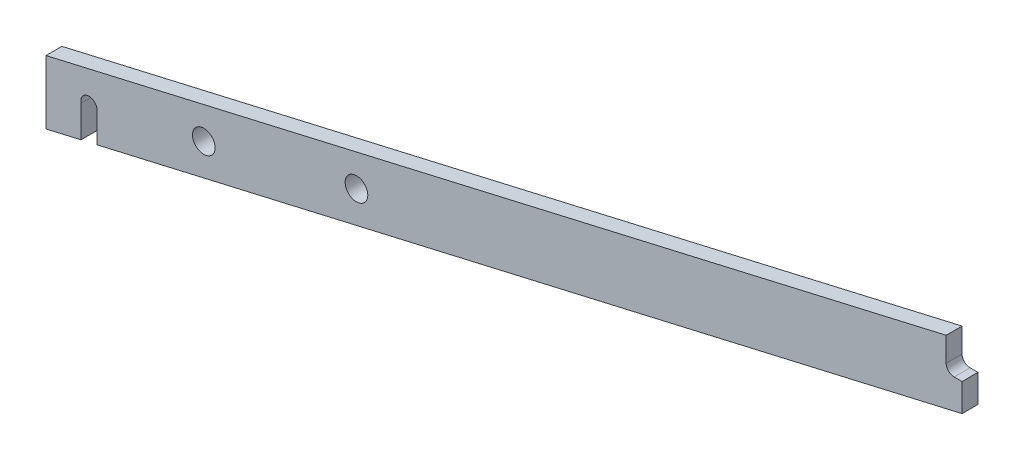
ISO-10303-21;
HEADER;
FILE_DESCRIPTION(('STEP AP214'),'2;1');
FILE_NAME('part.step','',(''),(''),'','','');
FILE_SCHEMA(('AUTOMOTIVE_DESIGN { 1 0 10303 214 1 1 1 1 }'));
ENDSEC;
DATA;
#1=APPLICATION_CONTEXT('core data for automotive mechanical design processes');
#2=APPLICATION_PROTOCOL_DEFINITION('international standard','automotive_design',2000,#1);
#3=PRODUCT_CONTEXT('',#1,'mechanical');
#4=PRODUCT('Part','Part','',(#3));
#5=PRODUCT_RELATED_PRODUCT_CATEGORY('part','',(#4));
#6=PRODUCT_DEFINITION_FORMATION('','',#4);
#7=PRODUCT_DEFINITION_CONTEXT('part definition',#1,'design');
#8=PRODUCT_DEFINITION('design','',#6,#7);
#9=PRODUCT_DEFINITION_SHAPE('','',#8);
#10=(LENGTH_UNIT() NAMED_UNIT(*) SI_UNIT(.MILLI.,.METRE.));
#11=(NAMED_UNIT(*) PLANE_ANGLE_UNIT() SI_UNIT($,.RADIAN.));
#12=(NAMED_UNIT(*) SI_UNIT($,.STERADIAN.) SOLID_ANGLE_UNIT());
#13=UNCERTAINTY_MEASURE_WITH_UNIT(LENGTH_MEASURE(1.E-05),#10,'distance_accuracy_value','');
#14=(GEOMETRIC_REPRESENTATION_CONTEXT(3) GLOBAL_UNCERTAINTY_ASSIGNED_CONTEXT((#13)) GLOBAL_UNIT_ASSIGNED_CONTEXT((#10,
#11,#12)) REPRESENTATION_CONTEXT('',''));
#15=CARTESIAN_POINT('',(0.,0.,0.));
#16=DIRECTION('',(0.,0.,1.));
#17=DIRECTION('',(1.,0.,0.));
#18=AXIS2_PLACEMENT_3D('',#15,#16,#17);
#19=CARTESIAN_POINT('',(0.,0.,1.5875));
#20=DIRECTION('',(-0.224951054343859,0.974370064785237,0.));
#21=DIRECTION('',(-0.974370064785237,-0.224951054343859,0.));
#22=AXIS2_PLACEMENT_3D('',#19,#20,#21);
#23=PLANE('',#22);
#24=DIRECTION('',(0.974370064785237,0.224951054343859,0.));
#25=VECTOR('',#24,1.);
#26=CARTESIAN_POINT('',(0.,0.,1.5875));
#27=LINE('',#26,#25);
#28=CARTESIAN_POINT('',(5.08,1.17281041091784,1.5875));
#29=VERTEX_POINT('',#28);
#30=CARTESIAN_POINT('',(91.44,21.1105873965209,1.5875));
#31=VERTEX_POINT('',#30);
#32=EDGE_CURVE('E159',#29,#31,#27,.T.);
#33=ORIENTED_EDGE('',*,*,#32,.F.);
#34=DIRECTION('',(0.,0.,1.));
#35=VECTOR('',#34,1.);
#36=CARTESIAN_POINT('',(5.08,1.17281041091784,-0.000999999999999916));
#37=LINE('',#36,#35);
#38=CARTESIAN_POINT('',(5.08,1.17281041091784,0.));
#39=VERTEX_POINT('',#38);
#40=EDGE_CURVE('E198',#39,#29,#37,.T.);
#41=ORIENTED_EDGE('',*,*,#40,.F.);
#42=DIRECTION('',(0.974370064785237,0.224951054343859,0.));
#43=VECTOR('',#42,1.);
#44=CARTESIAN_POINT('',(0.,0.,0.));
#45=LINE('',#44,#43);
#46=CARTESIAN_POINT('',(91.44,21.1105873965209,0.));
#47=VERTEX_POINT('',#46);
#48=EDGE_CURVE('E186',#39,#47,#45,.T.);
#49=ORIENTED_EDGE('',*,*,#48,.T.);
#50=DIRECTION('',(0.,0.,-1.));
#51=VECTOR('',#50,1.);
#52=CARTESIAN_POINT('',(91.44,21.1105873965209,1.5875));
#53=LINE('',#52,#51);
#54=EDGE_CURVE('E11',#31,#47,#53,.T.);
#55=ORIENTED_EDGE('',*,*,#54,.F.);
#56=EDGE_LOOP('',(#33,#41,#49,#55));
#57=FACE_BOUND('',#56,.T.);
#58=ADVANCED_FACE('F42',(#57),#23,.F.);
#59=CARTESIAN_POINT('',(0.,0.,0.));
#60=VERTEX_POINT('',#59);
#61=CARTESIAN_POINT('',(3.4925,0.806307157506014,0.));
#62=VERTEX_POINT('',#61);
#63=EDGE_CURVE('E162',#60,#62,#45,.T.);
#64=ORIENTED_EDGE('',*,*,#63,.T.);
#65=DIRECTION('',(0.,0.,1.));
#66=VECTOR('',#65,1.);
#67=CARTESIAN_POINT('',(3.4925,0.806307157506014,-0.000999999999999916));
#68=LINE('',#67,#66);
#69=CARTESIAN_POINT('',(3.4925,0.806307157506014,1.5875));
#70=VERTEX_POINT('',#69);
#71=EDGE_CURVE('E204',#62,#70,#68,.T.);
#72=ORIENTED_EDGE('',*,*,#71,.T.);
#73=CARTESIAN_POINT('',(0.,0.,1.5875));
#74=VERTEX_POINT('',#73);
#75=EDGE_CURVE('E210',#74,#70,#27,.T.);
#76=ORIENTED_EDGE('',*,*,#75,.F.);
#77=DIRECTION('',(0.,0.,-1.));
#78=VECTOR('',#77,1.);
#79=CARTESIAN_POINT('',(0.,0.,1.5875));
#80=LINE('',#79,#78);
#81=EDGE_CURVE('E166',#74,#60,#80,.T.);
#82=ORIENTED_EDGE('',*,*,#81,.T.);
#83=EDGE_LOOP('',(#64,#72,#76,#82));
#84=FACE_BOUND('',#83,.T.);
#85=ADVANCED_FACE('F44',(#84),#23,.F.);
#86=CARTESIAN_POINT('',(91.44,21.1105873965209,1.5875));
#87=DIRECTION('',(-1.,0.,0.));
#88=DIRECTION('',(0.,0.,1.));
#89=AXIS2_PLACEMENT_3D('',#86,#87,#88);
#90=PLANE('',#89);
#91=DIRECTION('',(0.,1.,0.));
#92=VECTOR('',#91,1.);
#93=CARTESIAN_POINT('',(91.44,21.1105873965209,0.));
#94=LINE('',#93,#92);
#95=CARTESIAN_POINT('',(91.44,23.8887123965209,0.));
#96=VERTEX_POINT('',#95);
#97=EDGE_CURVE('E155',#47,#96,#94,.T.);
#98=ORIENTED_EDGE('',*,*,#97,.T.);
#99=DIRECTION('',(0.,0.,1.));
#100=VECTOR('',#99,1.);
#101=CARTESIAN_POINT('',(91.44,23.8887123965209,-0.000999999999999916));
#102=LINE('',#101,#100);
#103=CARTESIAN_POINT('',(91.44,23.8887123965209,1.5875));
#104=VERTEX_POINT('',#103);
#105=EDGE_CURVE('E147',#96,#104,#102,.T.);
#106=ORIENTED_EDGE('',*,*,#105,.T.);
#107=DIRECTION('',(0.,1.,0.));
#108=VECTOR('',#107,1.);
#109=CARTESIAN_POINT('',(91.44,21.1105873965209,1.5875));
#110=LINE('',#109,#108);
#111=EDGE_CURVE('E181',#31,#104,#110,.T.);
#112=ORIENTED_EDGE('',*,*,#111,.F.);
#113=ORIENTED_EDGE('',*,*,#54,.T.);
#114=EDGE_LOOP('',(#98,#106,#112,#113));
#115=FACE_BOUND('',#114,.T.);
#116=ADVANCED_FACE('F223',(#115),#90,.F.);
#117=CARTESIAN_POINT('',(91.44,27.4605873965209,1.5875));
#118=DIRECTION('',(0.224951054343859,-0.974370064785237,0.));
#119=DIRECTION('',(0.974370064785237,0.224951054343859,0.));
#120=AXIS2_PLACEMENT_3D('',#117,#118,#119);
#121=PLANE('',#120);
#122=DIRECTION('',(-0.974370064785237,-0.224951054343859,0.));
#123=VECTOR('',#122,1.);
#124=CARTESIAN_POINT('',(91.44,27.4605873965209,1.5875));
#125=LINE('',#124,#123);
#126=CARTESIAN_POINT('',(89.8525,27.0940841431091,1.5875));
#127=VERTEX_POINT('',#126);
#128=CARTESIAN_POINT('',(0.,6.35,1.5875));
#129=VERTEX_POINT('',#128);
#130=EDGE_CURVE('E145',#127,#129,#125,.T.);
#131=ORIENTED_EDGE('',*,*,#130,.F.);
#132=DIRECTION('',(0.,0.,1.));
#133=VECTOR('',#132,1.);
#134=CARTESIAN_POINT('',(89.8525,27.0940841431091,-0.000999999999999916));
#135=LINE('',#134,#133);
#136=CARTESIAN_POINT('',(89.8525,27.0940841431091,0.));
#137=VERTEX_POINT('',#136);
#138=EDGE_CURVE('E129',#137,#127,#135,.T.);
#139=ORIENTED_EDGE('',*,*,#138,.F.);
#140=DIRECTION('',(-0.974370064785237,-0.224951054343859,0.));
#141=VECTOR('',#140,1.);
#142=CARTESIAN_POINT('',(91.44,27.4605873965209,0.));
#143=LINE('',#142,#141);
#144=CARTESIAN_POINT('',(0.,6.35,0.));
#145=VERTEX_POINT('',#144);
#146=EDGE_CURVE('E143',#137,#145,#143,.T.);
#147=ORIENTED_EDGE('',*,*,#146,.T.);
#148=DIRECTION('',(0.,0.,-1.));
#149=VECTOR('',#148,1.);
#150=CARTESIAN_POINT('',(0.,6.35,1.5875));
#151=LINE('',#150,#149);
#152=EDGE_CURVE('E51',#129,#145,#151,.T.);
#153=ORIENTED_EDGE('',*,*,#152,.F.);
#154=EDGE_LOOP('',(#131,#139,#147,#153));
#155=FACE_BOUND('',#154,.T.);
#156=ADVANCED_FACE('F141',(#155),#121,.F.);
#157=CARTESIAN_POINT('',(0.,6.35,1.5875));
#158=DIRECTION('',(1.,0.,0.));
#159=DIRECTION('',(0.,1.,0.));
#160=AXIS2_PLACEMENT_3D('',#157,#158,#159);
#161=PLANE('',#160);
#162=DIRECTION('',(0.,-1.,0.));
#163=VECTOR('',#162,1.);
#164=CARTESIAN_POINT('',(0.,6.35,0.));
#165=LINE('',#164,#163);
#166=EDGE_CURVE('E153',#145,#60,#165,.T.);
#167=ORIENTED_EDGE('',*,*,#166,.T.);
#168=ORIENTED_EDGE('',*,*,#81,.F.);
#169=DIRECTION('',(0.,-1.,0.));
#170=VECTOR('',#169,1.);
#171=CARTESIAN_POINT('',(0.,6.35,1.5875));
#172=LINE('',#171,#170);
#173=EDGE_CURVE('E169',#129,#74,#172,.T.);
#174=ORIENTED_EDGE('',*,*,#173,.F.);
#175=ORIENTED_EDGE('',*,*,#152,.T.);
#176=EDGE_LOOP('',(#167,#168,#174,#175));
#177=FACE_BOUND('',#176,.T.);
#178=ADVANCED_FACE('F173',(#177),#161,.F.);
#179=CARTESIAN_POINT('',(91.44,21.1105873965209,1.5875));
#180=DIRECTION('',(0.,0.,1.));
#181=DIRECTION('',(1.,0.,0.));
#182=AXIS2_PLACEMENT_3D('',#179,#180,#181);
#183=PLANE('',#182);
#184=CARTESIAN_POINT('',(30.988,10.3291435065987,1.5875));
#185=DIRECTION('',(0.,0.,1.));
#186=DIRECTION('',(1.,0.,0.));
#187=AXIS2_PLACEMENT_3D('',#184,#185,#186);
#188=CIRCLE('',#187,1.1303);
#189=CARTESIAN_POINT('',(32.1183,10.3291435065987,1.5875));
#190=VERTEX_POINT('',#189);
#191=EDGE_CURVE('E447',#190,#190,#188,.T.);
#192=ORIENTED_EDGE('',*,*,#191,.F.);
#193=EDGE_LOOP('',(#192));
#194=FACE_BOUND('',#193,.T.);
#195=CARTESIAN_POINT('',(15.748,6.81071227384526,1.5875));
#196=DIRECTION('',(0.,0.,1.));
#197=DIRECTION('',(1.,0.,0.));
#198=AXIS2_PLACEMENT_3D('',#195,#196,#197);
#199=CIRCLE('',#198,1.1303);
#200=CARTESIAN_POINT('',(16.8783,6.81071227384526,1.5875));
#201=VERTEX_POINT('',#200);
#202=EDGE_CURVE('E460',#201,#201,#199,.T.);
#203=ORIENTED_EDGE('',*,*,#202,.F.);
#204=EDGE_LOOP('',(#203));
#205=FACE_BOUND('',#204,.T.);
#206=DIRECTION('',(0.,-1.,0.));
#207=VECTOR('',#206,1.);
#208=CARTESIAN_POINT('',(89.8525000000005,-60.6738718189932,1.5875));
#209=LINE('',#208,#207);
#210=CARTESIAN_POINT('',(89.8525,24.6824623965209,1.5875));
#211=VERTEX_POINT('',#210);
#212=EDGE_CURVE('E137',#127,#211,#209,.T.);
#213=ORIENTED_EDGE('',*,*,#212,.F.);
#214=ORIENTED_EDGE('',*,*,#130,.T.);
#215=ORIENTED_EDGE('',*,*,#173,.T.);
#216=ORIENTED_EDGE('',*,*,#75,.T.);
#217=DIRECTION('',(0.,-1.,0.));
#218=VECTOR('',#217,1.);
#219=CARTESIAN_POINT('',(3.49250000000001,-60.6738718189935,1.5875));
#220=LINE('',#219,#218);
#221=CARTESIAN_POINT('',(3.4925,3.981307157506,1.5875));
#222=VERTEX_POINT('',#221);
#223=EDGE_CURVE('E243',#222,#70,#220,.T.);
#224=ORIENTED_EDGE('',*,*,#223,.F.);
#225=CARTESIAN_POINT('',(4.28625,4.16455878421191,1.5875));
#226=DIRECTION('',(0.,0.,1.));
#227=DIRECTION('',(1.,0.,0.));
#228=AXIS2_PLACEMENT_3D('',#225,#226,#227);
#229=CIRCLE('',#228,0.814628885561003);
#230=CARTESIAN_POINT('',(5.08,4.34781041091782,1.5875));
#231=VERTEX_POINT('',#230);
#232=EDGE_CURVE('E239',#231,#222,#229,.T.);
#233=ORIENTED_EDGE('',*,*,#232,.F.);
#234=DIRECTION('',(0.,1.,0.));
#235=VECTOR('',#234,1.);
#236=CARTESIAN_POINT('',(5.08,-60.6738718189935,1.5875));
#237=LINE('',#236,#235);
#238=EDGE_CURVE('E236',#29,#231,#237,.T.);
#239=ORIENTED_EDGE('',*,*,#238,.F.);
#240=ORIENTED_EDGE('',*,*,#32,.T.);
#241=ORIENTED_EDGE('',*,*,#111,.T.);
#242=DIRECTION('',(1.,0.,0.));
#243=VECTOR('',#242,1.);
#244=CARTESIAN_POINT('',(45.7208339644499,23.8887123965209,1.5875));
#245=LINE('',#244,#243);
#246=CARTESIAN_POINT('',(90.64625,23.8887123965209,1.5875));
#247=VERTEX_POINT('',#246);
#248=EDGE_CURVE('E218',#247,#104,#245,.T.);
#249=ORIENTED_EDGE('',*,*,#248,.F.);
#250=CARTESIAN_POINT('',(90.64625,24.6824623965209,1.5875));
#251=DIRECTION('',(0.,0.,1.));
#252=DIRECTION('',(1.,0.,0.));
#253=AXIS2_PLACEMENT_3D('',#250,#251,#252);
#254=CIRCLE('',#253,0.793749999999991);
#255=EDGE_CURVE('E475',#211,#247,#254,.T.);
#256=ORIENTED_EDGE('',*,*,#255,.F.);
#257=EDGE_LOOP('',(#213,#214,#215,#216,#224,#233,#239,#240,#241,#249,#256));
#258=FACE_BOUND('',#257,.T.);
#259=ADVANCED_FACE('F216',(#194,#205,#258),#183,.T.);
#260=CARTESIAN_POINT('',(91.44,21.1105873965209,0.));
#261=DIRECTION('',(0.,0.,1.));
#262=DIRECTION('',(1.,0.,0.));
#263=AXIS2_PLACEMENT_3D('',#260,#261,#262);
#264=PLANE('',#263);
#265=CARTESIAN_POINT('',(30.988,10.3291435065987,0.));
#266=DIRECTION('',(0.,0.,1.));
#267=DIRECTION('',(1.,0.,0.));
#268=AXIS2_PLACEMENT_3D('',#265,#266,#267);
#269=CIRCLE('',#268,1.1303);
#270=CARTESIAN_POINT('',(32.1183,10.3291435065987,0.));
#271=VERTEX_POINT('',#270);
#272=EDGE_CURVE('E450',#271,#271,#269,.F.);
#273=ORIENTED_EDGE('',*,*,#272,.F.);
#274=EDGE_LOOP('',(#273));
#275=FACE_BOUND('',#274,.T.);
#276=CARTESIAN_POINT('',(15.748,6.81071227384526,0.));
#277=DIRECTION('',(0.,0.,1.));
#278=DIRECTION('',(1.,0.,0.));
#279=AXIS2_PLACEMENT_3D('',#276,#277,#278);
#280=CIRCLE('',#279,1.1303);
#281=CARTESIAN_POINT('',(16.8783,6.81071227384526,0.));
#282=VERTEX_POINT('',#281);
#283=EDGE_CURVE('E454',#282,#282,#280,.F.);
#284=ORIENTED_EDGE('',*,*,#283,.F.);
#285=EDGE_LOOP('',(#284));
#286=FACE_BOUND('',#285,.T.);
#287=ORIENTED_EDGE('',*,*,#146,.F.);
#288=DIRECTION('',(0.,1.,0.));
#289=VECTOR('',#288,1.);
#290=CARTESIAN_POINT('',(89.8525000000005,-60.6738718189932,0.));
#291=LINE('',#290,#289);
#292=CARTESIAN_POINT('',(89.8525,24.6824623965209,0.));
#293=VERTEX_POINT('',#292);
#294=EDGE_CURVE('E125',#293,#137,#291,.T.);
#295=ORIENTED_EDGE('',*,*,#294,.F.);
#296=CARTESIAN_POINT('',(90.64625,24.6824623965209,0.));
#297=DIRECTION('',(0.,0.,1.));
#298=DIRECTION('',(1.,0.,0.));
#299=AXIS2_PLACEMENT_3D('',#296,#297,#298);
#300=CIRCLE('',#299,0.793749999999991);
#301=CARTESIAN_POINT('',(90.64625,23.8887123965209,0.));
#302=VERTEX_POINT('',#301);
#303=EDGE_CURVE('E148',#302,#293,#300,.F.);
#304=ORIENTED_EDGE('',*,*,#303,.F.);
#305=DIRECTION('',(-1.,0.,0.));
#306=VECTOR('',#305,1.);
#307=CARTESIAN_POINT('',(45.7208339644499,23.8887123965209,0.));
#308=LINE('',#307,#306);
#309=EDGE_CURVE('E58',#96,#302,#308,.T.);
#310=ORIENTED_EDGE('',*,*,#309,.F.);
#311=ORIENTED_EDGE('',*,*,#97,.F.);
#312=ORIENTED_EDGE('',*,*,#48,.F.);
#313=DIRECTION('',(0.,-1.,0.));
#314=VECTOR('',#313,1.);
#315=CARTESIAN_POINT('',(5.08,-60.6738718189935,0.));
#316=LINE('',#315,#314);
#317=CARTESIAN_POINT('',(5.08,4.34781041091782,0.));
#318=VERTEX_POINT('',#317);
#319=EDGE_CURVE('E227',#318,#39,#316,.T.);
#320=ORIENTED_EDGE('',*,*,#319,.F.);
#321=CARTESIAN_POINT('',(4.28625,4.16455878421191,0.));
#322=DIRECTION('',(0.,0.,1.));
#323=DIRECTION('',(1.,0.,0.));
#324=AXIS2_PLACEMENT_3D('',#321,#322,#323);
#325=CIRCLE('',#324,0.814628885561003);
#326=CARTESIAN_POINT('',(3.4925,3.981307157506,0.));
#327=VERTEX_POINT('',#326);
#328=EDGE_CURVE('E190',#327,#318,#325,.F.);
#329=ORIENTED_EDGE('',*,*,#328,.F.);
#330=DIRECTION('',(0.,1.,0.));
#331=VECTOR('',#330,1.);
#332=CARTESIAN_POINT('',(3.49250000000001,-60.6738718189935,0.));
#333=LINE('',#332,#331);
#334=EDGE_CURVE('E66',#62,#327,#333,.T.);
#335=ORIENTED_EDGE('',*,*,#334,.F.);
#336=ORIENTED_EDGE('',*,*,#63,.F.);
#337=ORIENTED_EDGE('',*,*,#166,.F.);
#338=EDGE_LOOP('',(#287,#295,#304,#310,#311,#312,#320,#329,#335,#336,#337));
#339=FACE_BOUND('',#338,.T.);
#340=ADVANCED_FACE('F151',(#275,#286,#339),#264,.F.);
#341=CARTESIAN_POINT('',(5.08,-60.6738718189935,-0.000999999999999916));
#342=DIRECTION('',(1.,0.,0.));
#343=DIRECTION('',(0.,0.,-1.));
#344=AXIS2_PLACEMENT_3D('',#341,#342,#343);
#345=PLANE('',#344);
#346=ORIENTED_EDGE('',*,*,#319,.T.);
#347=ORIENTED_EDGE('',*,*,#40,.T.);
#348=ORIENTED_EDGE('',*,*,#238,.T.);
#349=DIRECTION('',(0.,0.,1.));
#350=VECTOR('',#349,1.);
#351=CARTESIAN_POINT('',(5.08,4.34781041091782,-0.000999999999999916));
#352=LINE('',#351,#350);
#353=EDGE_CURVE('E208',#318,#231,#352,.T.);
#354=ORIENTED_EDGE('',*,*,#353,.F.);
#355=EDGE_LOOP('',(#346,#347,#348,#354));
#356=FACE_BOUND('',#355,.T.);
#357=ADVANCED_FACE('F253',(#356),#345,.F.);
#358=CARTESIAN_POINT('',(3.49250000000001,-60.6738718189935,-0.000999999999999916));
#359=DIRECTION('',(-1.,0.,0.));
#360=DIRECTION('',(0.,-1.,0.));
#361=AXIS2_PLACEMENT_3D('',#358,#359,#360);
#362=PLANE('',#361);
#363=ORIENTED_EDGE('',*,*,#334,.T.);
#364=DIRECTION('',(0.,0.,1.));
#365=VECTOR('',#364,1.);
#366=CARTESIAN_POINT('',(3.4925,3.981307157506,-0.000999999999999916));
#367=LINE('',#366,#365);
#368=EDGE_CURVE('E247',#327,#222,#367,.T.);
#369=ORIENTED_EDGE('',*,*,#368,.T.);
#370=ORIENTED_EDGE('',*,*,#223,.T.);
#371=ORIENTED_EDGE('',*,*,#71,.F.);
#372=EDGE_LOOP('',(#363,#369,#370,#371));
#373=FACE_BOUND('',#372,.T.);
#374=ADVANCED_FACE('F254',(#373),#362,.F.);
#375=CARTESIAN_POINT('',(4.28625,4.16455878421191,-0.000999999999999916));
#376=DIRECTION('',(0.,0.,1.));
#377=DIRECTION('',(1.,0.,0.));
#378=AXIS2_PLACEMENT_3D('',#375,#376,#377);
#379=CYLINDRICAL_SURFACE('',#378,0.814628885561003);
#380=ORIENTED_EDGE('',*,*,#328,.T.);
#381=ORIENTED_EDGE('',*,*,#353,.T.);
#382=ORIENTED_EDGE('',*,*,#232,.T.);
#383=ORIENTED_EDGE('',*,*,#368,.F.);
#384=EDGE_LOOP('',(#380,#381,#382,#383));
#385=FACE_BOUND('',#384,.T.);
#386=ADVANCED_FACE('F250',(#385),#379,.F.);
#387=CARTESIAN_POINT('',(89.8525000000005,-60.6738718189932,-0.000999999999999916));
#388=DIRECTION('',(-1.,0.,0.));
#389=DIRECTION('',(0.,-1.,0.));
#390=AXIS2_PLACEMENT_3D('',#387,#388,#389);
#391=PLANE('',#390);
#392=ORIENTED_EDGE('',*,*,#294,.T.);
#393=ORIENTED_EDGE('',*,*,#138,.T.);
#394=ORIENTED_EDGE('',*,*,#212,.T.);
#395=DIRECTION('',(0.,0.,1.));
#396=VECTOR('',#395,1.);
#397=CARTESIAN_POINT('',(89.8525,24.6824623965209,-0.000999999999999916));
#398=LINE('',#397,#396);
#399=EDGE_CURVE('E131',#293,#211,#398,.T.);
#400=ORIENTED_EDGE('',*,*,#399,.F.);
#401=EDGE_LOOP('',(#392,#393,#394,#400));
#402=FACE_BOUND('',#401,.T.);
#403=ADVANCED_FACE('F127',(#402),#391,.F.);
#404=CARTESIAN_POINT('',(45.7208339644499,23.8887123965209,-0.000999999999999916));
#405=DIRECTION('',(0.,-1.,0.));
#406=DIRECTION('',(0.,0.,-1.));
#407=AXIS2_PLACEMENT_3D('',#404,#405,#406);
#408=PLANE('',#407);
#409=ORIENTED_EDGE('',*,*,#309,.T.);
#410=DIRECTION('',(0.,0.,1.));
#411=VECTOR('',#410,1.);
#412=CARTESIAN_POINT('',(90.64625,23.8887123965209,-0.000999999999999916));
#413=LINE('',#412,#411);
#414=EDGE_CURVE('E468',#302,#247,#413,.T.);
#415=ORIENTED_EDGE('',*,*,#414,.T.);
#416=ORIENTED_EDGE('',*,*,#248,.T.);
#417=ORIENTED_EDGE('',*,*,#105,.F.);
#418=EDGE_LOOP('',(#409,#415,#416,#417));
#419=FACE_BOUND('',#418,.T.);
#420=ADVANCED_FACE('F329',(#419),#408,.F.);
#421=CARTESIAN_POINT('',(90.64625,24.6824623965209,-0.000999999999999916));
#422=DIRECTION('',(0.,0.,1.));
#423=DIRECTION('',(1.,0.,0.));
#424=AXIS2_PLACEMENT_3D('',#421,#422,#423);
#425=CYLINDRICAL_SURFACE('',#424,0.793749999999991);
#426=ORIENTED_EDGE('',*,*,#303,.T.);
#427=ORIENTED_EDGE('',*,*,#399,.T.);
#428=ORIENTED_EDGE('',*,*,#255,.T.);
#429=ORIENTED_EDGE('',*,*,#414,.F.);
#430=EDGE_LOOP('',(#426,#427,#428,#429));
#431=FACE_BOUND('',#430,.T.);
#432=ADVANCED_FACE('F337',(#431),#425,.F.);
#433=CARTESIAN_POINT('',(15.748,6.81071227384526,-0.000999999999999916));
#434=DIRECTION('',(0.,0.,1.));
#435=DIRECTION('',(1.,0.,0.));
#436=AXIS2_PLACEMENT_3D('',#433,#434,#435);
#437=CYLINDRICAL_SURFACE('',#436,1.1303);
#438=ORIENTED_EDGE('',*,*,#202,.T.);
#439=EDGE_LOOP('',(#438));
#440=FACE_BOUND('',#439,.T.);
#441=ORIENTED_EDGE('',*,*,#283,.T.);
#442=EDGE_LOOP('',(#441));
#443=FACE_BOUND('',#442,.T.);
#444=ADVANCED_FACE('F345',(#440,#443),#437,.F.);
#445=CARTESIAN_POINT('',(30.988,10.3291435065987,-0.000999999999999916));
#446=DIRECTION('',(0.,0.,1.));
#447=DIRECTION('',(1.,0.,0.));
#448=AXIS2_PLACEMENT_3D('',#445,#446,#447);
#449=CYLINDRICAL_SURFACE('',#448,1.1303);
#450=ORIENTED_EDGE('',*,*,#191,.T.);
#451=EDGE_LOOP('',(#450));
#452=FACE_BOUND('',#451,.T.);
#453=ORIENTED_EDGE('',*,*,#272,.T.);
#454=EDGE_LOOP('',(#453));
#455=FACE_BOUND('',#454,.T.);
#456=ADVANCED_FACE('F354',(#452,#455),#449,.F.);
#457=CLOSED_SHELL('',(#58,#85,#116,#156,#178,#259,#340,#357,#374,#386,#403,#420,#432,#444,#456));
#458=MANIFOLD_SOLID_BREP('B2',#457);
#459=ADVANCED_BREP_SHAPE_REPRESENTATION('',(#18,#458),#14);
#460=SHAPE_DEFINITION_REPRESENTATION(#9,#459);
ENDSEC;
END-ISO-10303-21;
